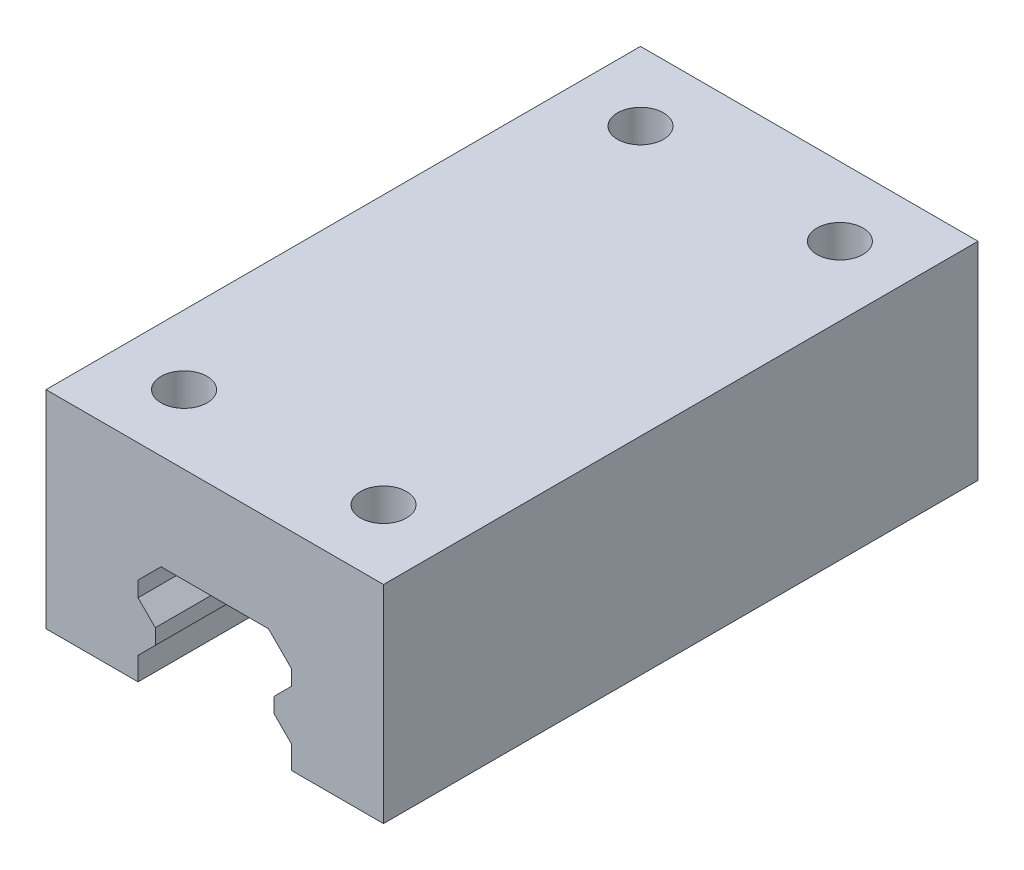
ISO-10303-21;
HEADER;
FILE_DESCRIPTION(('STEP AP214'),'2;1');
FILE_NAME('part.step','',(''),(''),'','','');
FILE_SCHEMA(('AUTOMOTIVE_DESIGN { 1 0 10303 214 1 1 1 1 }'));
ENDSEC;
DATA;
#1=APPLICATION_CONTEXT('core data for automotive mechanical design processes');
#2=APPLICATION_PROTOCOL_DEFINITION('international standard','automotive_design',2000,#1);
#3=PRODUCT_CONTEXT('',#1,'mechanical');
#4=PRODUCT('Part','Part','',(#3));
#5=PRODUCT_RELATED_PRODUCT_CATEGORY('part','',(#4));
#6=PRODUCT_DEFINITION_FORMATION('','',#4);
#7=PRODUCT_DEFINITION_CONTEXT('part definition',#1,'design');
#8=PRODUCT_DEFINITION('design','',#6,#7);
#9=PRODUCT_DEFINITION_SHAPE('','',#8);
#10=(LENGTH_UNIT() NAMED_UNIT(*) SI_UNIT(.MILLI.,.METRE.));
#11=(NAMED_UNIT(*) PLANE_ANGLE_UNIT() SI_UNIT($,.RADIAN.));
#12=(NAMED_UNIT(*) SI_UNIT($,.STERADIAN.) SOLID_ANGLE_UNIT());
#13=UNCERTAINTY_MEASURE_WITH_UNIT(LENGTH_MEASURE(1.E-05),#10,'distance_accuracy_value','');
#14=(GEOMETRIC_REPRESENTATION_CONTEXT(3) GLOBAL_UNCERTAINTY_ASSIGNED_CONTEXT((#13)) GLOBAL_UNIT_ASSIGNED_CONTEXT((#10,
#11,#12)) REPRESENTATION_CONTEXT('',''));
#15=CARTESIAN_POINT('',(0.,0.,0.));
#16=DIRECTION('',(0.,0.,1.));
#17=DIRECTION('',(1.,0.,0.));
#18=AXIS2_PLACEMENT_3D('',#15,#16,#17);
#19=CARTESIAN_POINT('',(22.,0.,-77.5));
#20=DIRECTION('',(-1.,0.,0.));
#21=DIRECTION('',(0.,-1.,0.));
#22=AXIS2_PLACEMENT_3D('',#19,#20,#21);
#23=PLANE('',#22);
#24=DIRECTION('',(0.,-1.,0.));
#25=VECTOR('',#24,1.);
#26=CARTESIAN_POINT('',(22.,0.,0.));
#27=LINE('',#26,#25);
#28=CARTESIAN_POINT('',(22.,32.3343195266273,0.));
#29=VERTEX_POINT('',#28);
#30=CARTESIAN_POINT('',(22.,5.33431952662725,0.));
#31=VERTEX_POINT('',#30);
#32=EDGE_CURVE('E203',#29,#31,#27,.T.);
#33=ORIENTED_EDGE('',*,*,#32,.T.);
#34=DIRECTION('',(0.,0.,1.));
#35=VECTOR('',#34,1.);
#36=CARTESIAN_POINT('',(22.,5.33431952662725,-77.5));
#37=LINE('',#36,#35);
#38=CARTESIAN_POINT('',(22.,5.33431952662725,-77.5));
#39=VERTEX_POINT('',#38);
#40=EDGE_CURVE('E11',#39,#31,#37,.T.);
#41=ORIENTED_EDGE('',*,*,#40,.F.);
#42=DIRECTION('',(0.,-1.,0.));
#43=VECTOR('',#42,1.);
#44=CARTESIAN_POINT('',(22.,0.,-77.5));
#45=LINE('',#44,#43);
#46=CARTESIAN_POINT('',(22.,32.3343195266273,-77.5));
#47=VERTEX_POINT('',#46);
#48=EDGE_CURVE('E267',#47,#39,#45,.T.);
#49=ORIENTED_EDGE('',*,*,#48,.F.);
#50=DIRECTION('',(0.,0.,1.));
#51=VECTOR('',#50,1.);
#52=CARTESIAN_POINT('',(22.,32.3343195266273,-77.5));
#53=LINE('',#52,#51);
#54=EDGE_CURVE('E44',#47,#29,#53,.T.);
#55=ORIENTED_EDGE('',*,*,#54,.T.);
#56=EDGE_LOOP('',(#33,#41,#49,#55));
#57=FACE_BOUND('',#56,.T.);
#58=ADVANCED_FACE('F41',(#57),#23,.F.);
#59=CARTESIAN_POINT('',(0.,5.33431952662724,-77.5));
#60=DIRECTION('',(0.,1.,0.));
#61=DIRECTION('',(-1.,0.,0.));
#62=AXIS2_PLACEMENT_3D('',#59,#60,#61);
#63=PLANE('',#62);
#64=DIRECTION('',(-1.,0.,0.));
#65=VECTOR('',#64,1.);
#66=CARTESIAN_POINT('',(0.,5.33431952662724,0.));
#67=LINE('',#66,#65);
#68=CARTESIAN_POINT('',(9.99999999999999,5.33431952662725,0.));
#69=VERTEX_POINT('',#68);
#70=EDGE_CURVE('E115',#31,#69,#67,.T.);
#71=ORIENTED_EDGE('',*,*,#70,.T.);
#72=DIRECTION('',(0.,0.,1.));
#73=VECTOR('',#72,1.);
#74=CARTESIAN_POINT('',(9.99999999999999,5.33431952662725,-77.5));
#75=LINE('',#74,#73);
#76=CARTESIAN_POINT('',(9.99999999999999,5.33431952662725,-77.5));
#77=VERTEX_POINT('',#76);
#78=EDGE_CURVE('E51',#77,#69,#75,.T.);
#79=ORIENTED_EDGE('',*,*,#78,.F.);
#80=DIRECTION('',(-1.,0.,0.));
#81=VECTOR('',#80,1.);
#82=CARTESIAN_POINT('',(0.,5.33431952662724,-77.5));
#83=LINE('',#82,#81);
#84=EDGE_CURVE('E59',#39,#77,#83,.T.);
#85=ORIENTED_EDGE('',*,*,#84,.F.);
#86=ORIENTED_EDGE('',*,*,#40,.T.);
#87=EDGE_LOOP('',(#71,#79,#85,#86));
#88=FACE_BOUND('',#87,.T.);
#89=ADVANCED_FACE('F334',(#88),#63,.F.);
#90=CARTESIAN_POINT('',(9.99999999999999,0.,-77.5));
#91=DIRECTION('',(1.,0.,0.));
#92=DIRECTION('',(0.,1.,0.));
#93=AXIS2_PLACEMENT_3D('',#90,#91,#92);
#94=PLANE('',#93);
#95=DIRECTION('',(0.,1.,0.));
#96=VECTOR('',#95,1.);
#97=CARTESIAN_POINT('',(9.99999999999999,0.,0.));
#98=LINE('',#97,#96);
#99=CARTESIAN_POINT('',(9.99999999999999,8.33431952662725,0.));
#100=VERTEX_POINT('',#99);
#101=EDGE_CURVE('E184',#69,#100,#98,.T.);
#102=ORIENTED_EDGE('',*,*,#101,.T.);
#103=DIRECTION('',(0.,0.,1.));
#104=VECTOR('',#103,1.);
#105=CARTESIAN_POINT('',(9.99999999999999,8.33431952662725,-77.5));
#106=LINE('',#105,#104);
#107=CARTESIAN_POINT('',(9.99999999999999,8.33431952662725,-77.5));
#108=VERTEX_POINT('',#107);
#109=EDGE_CURVE('E182',#108,#100,#106,.T.);
#110=ORIENTED_EDGE('',*,*,#109,.F.);
#111=DIRECTION('',(0.,1.,0.));
#112=VECTOR('',#111,1.);
#113=CARTESIAN_POINT('',(9.99999999999999,0.,-77.5));
#114=LINE('',#113,#112);
#115=EDGE_CURVE('E172',#77,#108,#114,.T.);
#116=ORIENTED_EDGE('',*,*,#115,.F.);
#117=ORIENTED_EDGE('',*,*,#78,.T.);
#118=EDGE_LOOP('',(#102,#110,#116,#117));
#119=FACE_BOUND('',#118,.T.);
#120=ADVANCED_FACE('F183',(#119),#94,.F.);
#121=CARTESIAN_POINT('',(9.16715976331361,9.16715976331363,-77.5));
#122=DIRECTION('',(0.707106781186547,0.707106781186548,0.));
#123=DIRECTION('',(-0.707106781186548,0.707106781186547,0.));
#124=AXIS2_PLACEMENT_3D('',#121,#122,#123);
#125=PLANE('',#124);
#126=DIRECTION('',(-0.707106781186548,0.707106781186547,0.));
#127=VECTOR('',#126,1.);
#128=CARTESIAN_POINT('',(9.16715976331361,9.16715976331363,0.));
#129=LINE('',#128,#127);
#130=CARTESIAN_POINT('',(7.74999999999999,10.5843195266272,0.));
#131=VERTEX_POINT('',#130);
#132=EDGE_CURVE('E261',#100,#131,#129,.T.);
#133=ORIENTED_EDGE('',*,*,#132,.T.);
#134=DIRECTION('',(0.,0.,1.));
#135=VECTOR('',#134,1.);
#136=CARTESIAN_POINT('',(7.74999999999999,10.5843195266272,-77.5));
#137=LINE('',#136,#135);
#138=CARTESIAN_POINT('',(7.74999999999999,10.5843195266272,-77.5));
#139=VERTEX_POINT('',#138);
#140=EDGE_CURVE('E188',#139,#131,#137,.T.);
#141=ORIENTED_EDGE('',*,*,#140,.F.);
#142=DIRECTION('',(-0.707106781186548,0.707106781186547,0.));
#143=VECTOR('',#142,1.);
#144=CARTESIAN_POINT('',(9.16715976331361,9.16715976331363,-77.5));
#145=LINE('',#144,#143);
#146=EDGE_CURVE('E176',#108,#139,#145,.T.);
#147=ORIENTED_EDGE('',*,*,#146,.F.);
#148=ORIENTED_EDGE('',*,*,#109,.T.);
#149=EDGE_LOOP('',(#133,#141,#147,#148));
#150=FACE_BOUND('',#149,.T.);
#151=ADVANCED_FACE('F190',(#150),#125,.F.);
#152=CARTESIAN_POINT('',(7.74999999999999,0.,-77.5));
#153=DIRECTION('',(1.,0.,0.));
#154=DIRECTION('',(0.,0.,-1.));
#155=AXIS2_PLACEMENT_3D('',#152,#153,#154);
#156=PLANE('',#155);
#157=DIRECTION('',(0.,1.,0.));
#158=VECTOR('',#157,1.);
#159=CARTESIAN_POINT('',(7.74999999999999,0.,0.));
#160=LINE('',#159,#158);
#161=CARTESIAN_POINT('',(7.74999999999999,12.5843195266272,0.));
#162=VERTEX_POINT('',#161);
#163=EDGE_CURVE('E258',#131,#162,#160,.T.);
#164=ORIENTED_EDGE('',*,*,#163,.T.);
#165=DIRECTION('',(0.,0.,1.));
#166=VECTOR('',#165,1.);
#167=CARTESIAN_POINT('',(7.74999999999999,12.5843195266272,-77.5));
#168=LINE('',#167,#166);
#169=CARTESIAN_POINT('',(7.74999999999999,12.5843195266272,-77.5));
#170=VERTEX_POINT('',#169);
#171=EDGE_CURVE('E273',#170,#162,#168,.T.);
#172=ORIENTED_EDGE('',*,*,#171,.F.);
#173=DIRECTION('',(0.,1.,0.));
#174=VECTOR('',#173,1.);
#175=CARTESIAN_POINT('',(7.74999999999999,0.,-77.5));
#176=LINE('',#175,#174);
#177=EDGE_CURVE('E194',#139,#170,#176,.T.);
#178=ORIENTED_EDGE('',*,*,#177,.F.);
#179=ORIENTED_EDGE('',*,*,#140,.T.);
#180=EDGE_LOOP('',(#164,#172,#178,#179));
#181=FACE_BOUND('',#180,.T.);
#182=ADVANCED_FACE('F347',(#181),#156,.F.);
#183=CARTESIAN_POINT('',(-2.41715976331362,2.41715976331362,-77.5));
#184=DIRECTION('',(0.707106781186548,-0.707106781186547,0.));
#185=DIRECTION('',(0.707106781186547,0.707106781186548,0.));
#186=AXIS2_PLACEMENT_3D('',#183,#184,#185);
#187=PLANE('',#186);
#188=DIRECTION('',(0.707106781186547,0.707106781186548,0.));
#189=VECTOR('',#188,1.);
#190=CARTESIAN_POINT('',(-2.41715976331362,2.41715976331362,0.));
#191=LINE('',#190,#189);
#192=CARTESIAN_POINT('',(10.,14.8343195266273,0.));
#193=VERTEX_POINT('',#192);
#194=EDGE_CURVE('E255',#162,#193,#191,.T.);
#195=ORIENTED_EDGE('',*,*,#194,.T.);
#196=DIRECTION('',(0.,0.,1.));
#197=VECTOR('',#196,1.);
#198=CARTESIAN_POINT('',(10.,14.8343195266273,-77.5));
#199=LINE('',#198,#197);
#200=CARTESIAN_POINT('',(10.,14.8343195266273,-77.5));
#201=VERTEX_POINT('',#200);
#202=EDGE_CURVE('E277',#201,#193,#199,.T.);
#203=ORIENTED_EDGE('',*,*,#202,.F.);
#204=DIRECTION('',(0.707106781186547,0.707106781186548,0.));
#205=VECTOR('',#204,1.);
#206=CARTESIAN_POINT('',(-2.41715976331362,2.41715976331362,-77.5));
#207=LINE('',#206,#205);
#208=EDGE_CURVE('E197',#170,#201,#207,.T.);
#209=ORIENTED_EDGE('',*,*,#208,.F.);
#210=ORIENTED_EDGE('',*,*,#171,.T.);
#211=EDGE_LOOP('',(#195,#203,#209,#210));
#212=FACE_BOUND('',#211,.T.);
#213=ADVANCED_FACE('F350',(#212),#187,.F.);
#214=CARTESIAN_POINT('',(10.,0.,-77.5));
#215=DIRECTION('',(1.,0.,0.));
#216=DIRECTION('',(0.,0.,-1.));
#217=AXIS2_PLACEMENT_3D('',#214,#215,#216);
#218=PLANE('',#217);
#219=DIRECTION('',(0.,1.,0.));
#220=VECTOR('',#219,1.);
#221=CARTESIAN_POINT('',(10.,0.,0.));
#222=LINE('',#221,#220);
#223=CARTESIAN_POINT('',(10.,16.8343195266273,0.));
#224=VERTEX_POINT('',#223);
#225=EDGE_CURVE('E252',#193,#224,#222,.T.);
#226=ORIENTED_EDGE('',*,*,#225,.T.);
#227=DIRECTION('',(0.,0.,1.));
#228=VECTOR('',#227,1.);
#229=CARTESIAN_POINT('',(10.,16.8343195266273,-77.5));
#230=LINE('',#229,#228);
#231=CARTESIAN_POINT('',(10.,16.8343195266273,-77.5));
#232=VERTEX_POINT('',#231);
#233=EDGE_CURVE('E281',#232,#224,#230,.T.);
#234=ORIENTED_EDGE('',*,*,#233,.F.);
#235=DIRECTION('',(0.,1.,0.));
#236=VECTOR('',#235,1.);
#237=CARTESIAN_POINT('',(10.,0.,-77.5));
#238=LINE('',#237,#236);
#239=EDGE_CURVE('E443',#201,#232,#238,.T.);
#240=ORIENTED_EDGE('',*,*,#239,.F.);
#241=ORIENTED_EDGE('',*,*,#202,.T.);
#242=EDGE_LOOP('',(#226,#234,#240,#241));
#243=FACE_BOUND('',#242,.T.);
#244=ADVANCED_FACE('F354',(#243),#218,.F.);
#245=CARTESIAN_POINT('',(13.4171597633136,13.4171597633137,-77.5));
#246=DIRECTION('',(0.707106781186546,0.707106781186549,0.));
#247=DIRECTION('',(-0.707106781186549,0.707106781186546,0.));
#248=AXIS2_PLACEMENT_3D('',#245,#246,#247);
#249=PLANE('',#248);
#250=DIRECTION('',(-0.707106781186549,0.707106781186546,0.));
#251=VECTOR('',#250,1.);
#252=CARTESIAN_POINT('',(13.4171597633136,13.4171597633137,0.));
#253=LINE('',#252,#251);
#254=CARTESIAN_POINT('',(7.,19.8343195266273,0.));
#255=VERTEX_POINT('',#254);
#256=EDGE_CURVE('E248',#224,#255,#253,.T.);
#257=ORIENTED_EDGE('',*,*,#256,.T.);
#258=DIRECTION('',(0.,0.,1.));
#259=VECTOR('',#258,1.);
#260=CARTESIAN_POINT('',(7.,19.8343195266273,-77.5));
#261=LINE('',#260,#259);
#262=CARTESIAN_POINT('',(7.,19.8343195266273,-77.5));
#263=VERTEX_POINT('',#262);
#264=EDGE_CURVE('E285',#263,#255,#261,.T.);
#265=ORIENTED_EDGE('',*,*,#264,.F.);
#266=DIRECTION('',(-0.707106781186549,0.707106781186546,0.));
#267=VECTOR('',#266,1.);
#268=CARTESIAN_POINT('',(13.4171597633136,13.4171597633137,-77.5));
#269=LINE('',#268,#267);
#270=EDGE_CURVE('E440',#232,#263,#269,.T.);
#271=ORIENTED_EDGE('',*,*,#270,.F.);
#272=ORIENTED_EDGE('',*,*,#233,.T.);
#273=EDGE_LOOP('',(#257,#265,#271,#272));
#274=FACE_BOUND('',#273,.T.);
#275=ADVANCED_FACE('F358',(#274),#249,.F.);
#276=CARTESIAN_POINT('',(0.,19.8343195266273,-77.5));
#277=DIRECTION('',(0.,-1.,0.));
#278=DIRECTION('',(1.,0.,0.));
#279=AXIS2_PLACEMENT_3D('',#276,#277,#278);
#280=PLANE('',#279);
#281=DIRECTION('',(1.,0.,0.));
#282=VECTOR('',#281,1.);
#283=CARTESIAN_POINT('',(0.,19.8343195266273,0.));
#284=LINE('',#283,#282);
#285=CARTESIAN_POINT('',(-6.99999999999999,19.8343195266273,0.));
#286=VERTEX_POINT('',#285);
#287=EDGE_CURVE('E244',#286,#255,#284,.T.);
#288=ORIENTED_EDGE('',*,*,#287,.F.);
#289=DIRECTION('',(0.,0.,1.));
#290=VECTOR('',#289,1.);
#291=CARTESIAN_POINT('',(-6.99999999999999,19.8343195266273,-77.5));
#292=LINE('',#291,#290);
#293=CARTESIAN_POINT('',(-6.99999999999999,19.8343195266273,-77.5));
#294=VERTEX_POINT('',#293);
#295=EDGE_CURVE('E288',#294,#286,#292,.T.);
#296=ORIENTED_EDGE('',*,*,#295,.F.);
#297=DIRECTION('',(1.,0.,0.));
#298=VECTOR('',#297,1.);
#299=CARTESIAN_POINT('',(0.,19.8343195266273,-77.5));
#300=LINE('',#299,#298);
#301=EDGE_CURVE('E436',#294,#263,#300,.T.);
#302=ORIENTED_EDGE('',*,*,#301,.T.);
#303=ORIENTED_EDGE('',*,*,#264,.T.);
#304=EDGE_LOOP('',(#288,#296,#302,#303));
#305=FACE_BOUND('',#304,.T.);
#306=ADVANCED_FACE('F362',(#305),#280,.T.);
#307=CARTESIAN_POINT('',(-13.4171597633136,13.4171597633137,-77.5));
#308=DIRECTION('',(0.707106781186546,-0.707106781186548,0.));
#309=DIRECTION('',(0.707106781186549,0.707106781186546,0.));
#310=AXIS2_PLACEMENT_3D('',#307,#308,#309);
#311=PLANE('',#310);
#312=DIRECTION('',(0.707106781186549,0.707106781186547,0.));
#313=VECTOR('',#312,1.);
#314=CARTESIAN_POINT('',(-13.4171597633136,13.4171597633137,0.));
#315=LINE('',#314,#313);
#316=CARTESIAN_POINT('',(-9.99999999999999,16.8343195266273,0.));
#317=VERTEX_POINT('',#316);
#318=EDGE_CURVE('E240',#317,#286,#315,.T.);
#319=ORIENTED_EDGE('',*,*,#318,.F.);
#320=DIRECTION('',(0.,0.,1.));
#321=VECTOR('',#320,1.);
#322=CARTESIAN_POINT('',(-9.99999999999999,16.8343195266273,-77.5));
#323=LINE('',#322,#321);
#324=CARTESIAN_POINT('',(-9.99999999999999,16.8343195266273,-77.5));
#325=VERTEX_POINT('',#324);
#326=EDGE_CURVE('E291',#325,#317,#323,.T.);
#327=ORIENTED_EDGE('',*,*,#326,.F.);
#328=DIRECTION('',(0.707106781186549,0.707106781186547,0.));
#329=VECTOR('',#328,1.);
#330=CARTESIAN_POINT('',(-13.4171597633136,13.4171597633137,-77.5));
#331=LINE('',#330,#329);
#332=EDGE_CURVE('E432',#325,#294,#331,.T.);
#333=ORIENTED_EDGE('',*,*,#332,.T.);
#334=ORIENTED_EDGE('',*,*,#295,.T.);
#335=EDGE_LOOP('',(#319,#327,#333,#334));
#336=FACE_BOUND('',#335,.T.);
#337=ADVANCED_FACE('F366',(#336),#311,.T.);
#338=CARTESIAN_POINT('',(-9.99999999999999,0.,-77.5));
#339=DIRECTION('',(1.,0.,0.));
#340=DIRECTION('',(0.,0.,-1.));
#341=AXIS2_PLACEMENT_3D('',#338,#339,#340);
#342=PLANE('',#341);
#343=DIRECTION('',(0.,1.,0.));
#344=VECTOR('',#343,1.);
#345=CARTESIAN_POINT('',(-9.99999999999999,0.,0.));
#346=LINE('',#345,#344);
#347=CARTESIAN_POINT('',(-9.99999999999999,14.8343195266273,0.));
#348=VERTEX_POINT('',#347);
#349=EDGE_CURVE('E236',#348,#317,#346,.T.);
#350=ORIENTED_EDGE('',*,*,#349,.F.);
#351=DIRECTION('',(0.,0.,1.));
#352=VECTOR('',#351,1.);
#353=CARTESIAN_POINT('',(-9.99999999999999,14.8343195266273,-77.5));
#354=LINE('',#353,#352);
#355=CARTESIAN_POINT('',(-9.99999999999999,14.8343195266273,-77.5));
#356=VERTEX_POINT('',#355);
#357=EDGE_CURVE('E294',#356,#348,#354,.T.);
#358=ORIENTED_EDGE('',*,*,#357,.F.);
#359=DIRECTION('',(0.,1.,0.));
#360=VECTOR('',#359,1.);
#361=CARTESIAN_POINT('',(-9.99999999999999,0.,-77.5));
#362=LINE('',#361,#360);
#363=EDGE_CURVE('E428',#356,#325,#362,.T.);
#364=ORIENTED_EDGE('',*,*,#363,.T.);
#365=ORIENTED_EDGE('',*,*,#326,.T.);
#366=EDGE_LOOP('',(#350,#358,#364,#365));
#367=FACE_BOUND('',#366,.T.);
#368=ADVANCED_FACE('F370',(#367),#342,.T.);
#369=CARTESIAN_POINT('',(2.41715976331362,2.41715976331361,-77.5));
#370=DIRECTION('',(0.707106781186549,0.707106781186546,0.));
#371=DIRECTION('',(-0.707106781186546,0.707106781186549,0.));
#372=AXIS2_PLACEMENT_3D('',#369,#370,#371);
#373=PLANE('',#372);
#374=DIRECTION('',(-0.707106781186546,0.707106781186549,0.));
#375=VECTOR('',#374,1.);
#376=CARTESIAN_POINT('',(2.41715976331362,2.41715976331361,0.));
#377=LINE('',#376,#375);
#378=CARTESIAN_POINT('',(-7.74999999999999,12.5843195266272,0.));
#379=VERTEX_POINT('',#378);
#380=EDGE_CURVE('E232',#379,#348,#377,.T.);
#381=ORIENTED_EDGE('',*,*,#380,.F.);
#382=DIRECTION('',(0.,0.,1.));
#383=VECTOR('',#382,1.);
#384=CARTESIAN_POINT('',(-7.74999999999999,12.5843195266272,-77.5));
#385=LINE('',#384,#383);
#386=CARTESIAN_POINT('',(-7.74999999999999,12.5843195266272,-77.5));
#387=VERTEX_POINT('',#386);
#388=EDGE_CURVE('E297',#387,#379,#385,.T.);
#389=ORIENTED_EDGE('',*,*,#388,.F.);
#390=DIRECTION('',(-0.707106781186546,0.707106781186549,0.));
#391=VECTOR('',#390,1.);
#392=CARTESIAN_POINT('',(2.41715976331362,2.41715976331361,-77.5));
#393=LINE('',#392,#391);
#394=EDGE_CURVE('E424',#387,#356,#393,.T.);
#395=ORIENTED_EDGE('',*,*,#394,.T.);
#396=ORIENTED_EDGE('',*,*,#357,.T.);
#397=EDGE_LOOP('',(#381,#389,#395,#396));
#398=FACE_BOUND('',#397,.T.);
#399=ADVANCED_FACE('F374',(#398),#373,.T.);
#400=CARTESIAN_POINT('',(-7.74999999999999,0.,-77.5));
#401=DIRECTION('',(1.,0.,0.));
#402=DIRECTION('',(0.,0.,-1.));
#403=AXIS2_PLACEMENT_3D('',#400,#401,#402);
#404=PLANE('',#403);
#405=DIRECTION('',(0.,1.,0.));
#406=VECTOR('',#405,1.);
#407=CARTESIAN_POINT('',(-7.74999999999999,0.,0.));
#408=LINE('',#407,#406);
#409=CARTESIAN_POINT('',(-7.74999999999999,10.5843195266272,0.));
#410=VERTEX_POINT('',#409);
#411=EDGE_CURVE('E228',#410,#379,#408,.T.);
#412=ORIENTED_EDGE('',*,*,#411,.F.);
#413=DIRECTION('',(0.,0.,1.));
#414=VECTOR('',#413,1.);
#415=CARTESIAN_POINT('',(-7.74999999999999,10.5843195266272,-77.5));
#416=LINE('',#415,#414);
#417=CARTESIAN_POINT('',(-7.74999999999999,10.5843195266272,-77.5));
#418=VERTEX_POINT('',#417);
#419=EDGE_CURVE('E300',#418,#410,#416,.T.);
#420=ORIENTED_EDGE('',*,*,#419,.F.);
#421=DIRECTION('',(0.,1.,0.));
#422=VECTOR('',#421,1.);
#423=CARTESIAN_POINT('',(-7.74999999999999,0.,-77.5));
#424=LINE('',#423,#422);
#425=EDGE_CURVE('E420',#418,#387,#424,.T.);
#426=ORIENTED_EDGE('',*,*,#425,.T.);
#427=ORIENTED_EDGE('',*,*,#388,.T.);
#428=EDGE_LOOP('',(#412,#420,#426,#427));
#429=FACE_BOUND('',#428,.T.);
#430=ADVANCED_FACE('F378',(#429),#404,.T.);
#431=CARTESIAN_POINT('',(-9.16715976331361,9.16715976331363,-77.5));
#432=DIRECTION('',(0.707106781186547,-0.707106781186548,0.));
#433=DIRECTION('',(0.707106781186548,0.707106781186547,0.));
#434=AXIS2_PLACEMENT_3D('',#431,#432,#433);
#435=PLANE('',#434);
#436=DIRECTION('',(0.707106781186548,0.707106781186547,0.));
#437=VECTOR('',#436,1.);
#438=CARTESIAN_POINT('',(-9.16715976331361,9.16715976331363,0.));
#439=LINE('',#438,#437);
#440=CARTESIAN_POINT('',(-10.,8.33431952662725,0.));
#441=VERTEX_POINT('',#440);
#442=EDGE_CURVE('E224',#441,#410,#439,.T.);
#443=ORIENTED_EDGE('',*,*,#442,.F.);
#444=DIRECTION('',(0.,0.,1.));
#445=VECTOR('',#444,1.);
#446=CARTESIAN_POINT('',(-10.,8.33431952662725,-77.5));
#447=LINE('',#446,#445);
#448=CARTESIAN_POINT('',(-10.,8.33431952662725,-77.5));
#449=VERTEX_POINT('',#448);
#450=EDGE_CURVE('E303',#449,#441,#447,.T.);
#451=ORIENTED_EDGE('',*,*,#450,.F.);
#452=DIRECTION('',(0.707106781186548,0.707106781186547,0.));
#453=VECTOR('',#452,1.);
#454=CARTESIAN_POINT('',(-9.16715976331361,9.16715976331363,-77.5));
#455=LINE('',#454,#453);
#456=EDGE_CURVE('E416',#449,#418,#455,.T.);
#457=ORIENTED_EDGE('',*,*,#456,.T.);
#458=ORIENTED_EDGE('',*,*,#419,.T.);
#459=EDGE_LOOP('',(#443,#451,#457,#458));
#460=FACE_BOUND('',#459,.T.);
#461=ADVANCED_FACE('F382',(#460),#435,.T.);
#462=CARTESIAN_POINT('',(-9.99999999999999,0.,-77.5));
#463=DIRECTION('',(1.,0.,0.));
#464=DIRECTION('',(0.,1.,0.));
#465=AXIS2_PLACEMENT_3D('',#462,#463,#464);
#466=PLANE('',#465);
#467=DIRECTION('',(0.,1.,0.));
#468=VECTOR('',#467,1.);
#469=CARTESIAN_POINT('',(-9.99999999999999,0.,0.));
#470=LINE('',#469,#468);
#471=CARTESIAN_POINT('',(-9.99999999999999,5.33431952662725,0.));
#472=VERTEX_POINT('',#471);
#473=EDGE_CURVE('E220',#472,#441,#470,.T.);
#474=ORIENTED_EDGE('',*,*,#473,.F.);
#475=DIRECTION('',(0.,0.,1.));
#476=VECTOR('',#475,1.);
#477=CARTESIAN_POINT('',(-9.99999999999999,5.33431952662725,-77.5));
#478=LINE('',#477,#476);
#479=CARTESIAN_POINT('',(-9.99999999999999,5.33431952662725,-77.5));
#480=VERTEX_POINT('',#479);
#481=EDGE_CURVE('E306',#480,#472,#478,.T.);
#482=ORIENTED_EDGE('',*,*,#481,.F.);
#483=DIRECTION('',(0.,1.,0.));
#484=VECTOR('',#483,1.);
#485=CARTESIAN_POINT('',(-9.99999999999999,0.,-77.5));
#486=LINE('',#485,#484);
#487=EDGE_CURVE('E408',#480,#449,#486,.T.);
#488=ORIENTED_EDGE('',*,*,#487,.T.);
#489=ORIENTED_EDGE('',*,*,#450,.T.);
#490=EDGE_LOOP('',(#474,#482,#488,#489));
#491=FACE_BOUND('',#490,.T.);
#492=ADVANCED_FACE('F386',(#491),#466,.T.);
#493=CARTESIAN_POINT('',(0.,5.33431952662724,-77.5));
#494=DIRECTION('',(0.,-1.,0.));
#495=DIRECTION('',(1.,0.,0.));
#496=AXIS2_PLACEMENT_3D('',#493,#494,#495);
#497=PLANE('',#496);
#498=DIRECTION('',(1.,0.,0.));
#499=VECTOR('',#498,1.);
#500=CARTESIAN_POINT('',(0.,5.33431952662724,0.));
#501=LINE('',#500,#499);
#502=CARTESIAN_POINT('',(-22.,5.33431952662725,0.));
#503=VERTEX_POINT('',#502);
#504=EDGE_CURVE('E216',#503,#472,#501,.T.);
#505=ORIENTED_EDGE('',*,*,#504,.F.);
#506=DIRECTION('',(0.,0.,1.));
#507=VECTOR('',#506,1.);
#508=CARTESIAN_POINT('',(-22.,5.33431952662725,-77.5));
#509=LINE('',#508,#507);
#510=CARTESIAN_POINT('',(-22.,5.33431952662725,-77.5));
#511=VERTEX_POINT('',#510);
#512=EDGE_CURVE('E309',#511,#503,#509,.T.);
#513=ORIENTED_EDGE('',*,*,#512,.F.);
#514=DIRECTION('',(1.,0.,0.));
#515=VECTOR('',#514,1.);
#516=CARTESIAN_POINT('',(0.,5.33431952662724,-77.5));
#517=LINE('',#516,#515);
#518=EDGE_CURVE('E403',#511,#480,#517,.T.);
#519=ORIENTED_EDGE('',*,*,#518,.T.);
#520=ORIENTED_EDGE('',*,*,#481,.T.);
#521=EDGE_LOOP('',(#505,#513,#519,#520));
#522=FACE_BOUND('',#521,.T.);
#523=ADVANCED_FACE('F328',(#522),#497,.T.);
#524=CARTESIAN_POINT('',(-22.,0.,-77.5));
#525=DIRECTION('',(-1.,0.,0.));
#526=DIRECTION('',(0.,-1.,0.));
#527=AXIS2_PLACEMENT_3D('',#524,#525,#526);
#528=PLANE('',#527);
#529=DIRECTION('',(0.,-1.,0.));
#530=VECTOR('',#529,1.);
#531=CARTESIAN_POINT('',(-22.,0.,0.));
#532=LINE('',#531,#530);
#533=CARTESIAN_POINT('',(-22.,32.3343195266273,0.));
#534=VERTEX_POINT('',#533);
#535=EDGE_CURVE('E212',#534,#503,#532,.T.);
#536=ORIENTED_EDGE('',*,*,#535,.F.);
#537=DIRECTION('',(0.,0.,1.));
#538=VECTOR('',#537,1.);
#539=CARTESIAN_POINT('',(-22.,32.3343195266273,-77.5));
#540=LINE('',#539,#538);
#541=CARTESIAN_POINT('',(-22.,32.3343195266273,-77.5));
#542=VERTEX_POINT('',#541);
#543=EDGE_CURVE('E311',#542,#534,#540,.T.);
#544=ORIENTED_EDGE('',*,*,#543,.F.);
#545=DIRECTION('',(0.,-1.,0.));
#546=VECTOR('',#545,1.);
#547=CARTESIAN_POINT('',(-22.,0.,-77.5));
#548=LINE('',#547,#546);
#549=EDGE_CURVE('E401',#542,#511,#548,.T.);
#550=ORIENTED_EDGE('',*,*,#549,.T.);
#551=ORIENTED_EDGE('',*,*,#512,.T.);
#552=EDGE_LOOP('',(#536,#544,#550,#551));
#553=FACE_BOUND('',#552,.T.);
#554=ADVANCED_FACE('F321',(#553),#528,.T.);
#555=CARTESIAN_POINT('',(0.,32.3343195266273,-77.5));
#556=DIRECTION('',(0.,1.,0.));
#557=DIRECTION('',(-1.,0.,0.));
#558=AXIS2_PLACEMENT_3D('',#555,#556,#557);
#559=PLANE('',#558);
#560=CARTESIAN_POINT('',(13.,32.3343195266273,-8.99999999999999));
#561=DIRECTION('',(0.,1.,0.));
#562=DIRECTION('',(0.,0.,-1.));
#563=AXIS2_PLACEMENT_3D('',#560,#561,#562);
#564=CIRCLE('',#563,3.);
#565=CARTESIAN_POINT('',(13.,32.3343195266273,-12.));
#566=VERTEX_POINT('',#565);
#567=EDGE_CURVE('E480',#566,#566,#564,.T.);
#568=ORIENTED_EDGE('',*,*,#567,.F.);
#569=EDGE_LOOP('',(#568));
#570=FACE_BOUND('',#569,.T.);
#571=CARTESIAN_POINT('',(13.,32.3343195266273,-68.5));
#572=DIRECTION('',(0.,1.,0.));
#573=DIRECTION('',(0.,0.,-1.));
#574=AXIS2_PLACEMENT_3D('',#571,#572,#573);
#575=CIRCLE('',#574,3.00000000000001);
#576=CARTESIAN_POINT('',(13.,32.3343195266273,-71.5));
#577=VERTEX_POINT('',#576);
#578=EDGE_CURVE('E488',#577,#577,#575,.T.);
#579=ORIENTED_EDGE('',*,*,#578,.F.);
#580=EDGE_LOOP('',(#579));
#581=FACE_BOUND('',#580,.T.);
#582=CARTESIAN_POINT('',(-13.,32.3343195266273,-68.5));
#583=DIRECTION('',(0.,1.,0.));
#584=DIRECTION('',(0.,0.,1.));
#585=AXIS2_PLACEMENT_3D('',#582,#583,#584);
#586=CIRCLE('',#585,3.);
#587=CARTESIAN_POINT('',(-13.,32.3343195266273,-65.5));
#588=VERTEX_POINT('',#587);
#589=EDGE_CURVE('E496',#588,#588,#586,.T.);
#590=ORIENTED_EDGE('',*,*,#589,.F.);
#591=EDGE_LOOP('',(#590));
#592=FACE_BOUND('',#591,.T.);
#593=CARTESIAN_POINT('',(-13.,32.3343195266273,-8.99999999999999));
#594=DIRECTION('',(0.,1.,0.));
#595=DIRECTION('',(0.,0.,1.));
#596=AXIS2_PLACEMENT_3D('',#593,#594,#595);
#597=CIRCLE('',#596,3.);
#598=CARTESIAN_POINT('',(-13.,32.3343195266273,-5.99999999999999));
#599=VERTEX_POINT('',#598);
#600=EDGE_CURVE('E472',#599,#599,#597,.T.);
#601=ORIENTED_EDGE('',*,*,#600,.F.);
#602=EDGE_LOOP('',(#601));
#603=FACE_BOUND('',#602,.T.);
#604=DIRECTION('',(-1.,0.,0.));
#605=VECTOR('',#604,1.);
#606=CARTESIAN_POINT('',(0.,32.3343195266273,0.));
#607=LINE('',#606,#605);
#608=EDGE_CURVE('E207',#29,#534,#607,.T.);
#609=ORIENTED_EDGE('',*,*,#608,.F.);
#610=ORIENTED_EDGE('',*,*,#54,.F.);
#611=DIRECTION('',(-1.,0.,0.));
#612=VECTOR('',#611,1.);
#613=CARTESIAN_POINT('',(0.,32.3343195266273,-77.5));
#614=LINE('',#613,#612);
#615=EDGE_CURVE('E404',#47,#542,#614,.T.);
#616=ORIENTED_EDGE('',*,*,#615,.T.);
#617=ORIENTED_EDGE('',*,*,#543,.T.);
#618=EDGE_LOOP('',(#609,#610,#616,#617));
#619=FACE_BOUND('',#618,.T.);
#620=ADVANCED_FACE('F319',(#570,#581,#592,#603,#619),#559,.T.);
#621=CARTESIAN_POINT('',(0.,0.,-77.5));
#622=DIRECTION('',(0.,0.,1.));
#623=DIRECTION('',(1.,0.,0.));
#624=AXIS2_PLACEMENT_3D('',#621,#622,#623);
#625=PLANE('',#624);
#626=ORIENTED_EDGE('',*,*,#48,.T.);
#627=ORIENTED_EDGE('',*,*,#84,.T.);
#628=ORIENTED_EDGE('',*,*,#115,.T.);
#629=ORIENTED_EDGE('',*,*,#146,.T.);
#630=ORIENTED_EDGE('',*,*,#177,.T.);
#631=ORIENTED_EDGE('',*,*,#208,.T.);
#632=ORIENTED_EDGE('',*,*,#239,.T.);
#633=ORIENTED_EDGE('',*,*,#270,.T.);
#634=ORIENTED_EDGE('',*,*,#301,.F.);
#635=ORIENTED_EDGE('',*,*,#332,.F.);
#636=ORIENTED_EDGE('',*,*,#363,.F.);
#637=ORIENTED_EDGE('',*,*,#394,.F.);
#638=ORIENTED_EDGE('',*,*,#425,.F.);
#639=ORIENTED_EDGE('',*,*,#456,.F.);
#640=ORIENTED_EDGE('',*,*,#487,.F.);
#641=ORIENTED_EDGE('',*,*,#518,.F.);
#642=ORIENTED_EDGE('',*,*,#549,.F.);
#643=ORIENTED_EDGE('',*,*,#615,.F.);
#644=EDGE_LOOP('',(#626,#627,#628,#629,#630,#631,#632,#633,#634,#635,#636,#637,#638,#639,#640,
#641,#642,#643));
#645=FACE_BOUND('',#644,.T.);
#646=ADVANCED_FACE('F174',(#645),#625,.F.);
#647=CARTESIAN_POINT('',(0.,0.,0.));
#648=DIRECTION('',(0.,0.,1.));
#649=DIRECTION('',(1.,0.,0.));
#650=AXIS2_PLACEMENT_3D('',#647,#648,#649);
#651=PLANE('',#650);
#652=ORIENTED_EDGE('',*,*,#32,.F.);
#653=ORIENTED_EDGE('',*,*,#608,.T.);
#654=ORIENTED_EDGE('',*,*,#535,.T.);
#655=ORIENTED_EDGE('',*,*,#504,.T.);
#656=ORIENTED_EDGE('',*,*,#473,.T.);
#657=ORIENTED_EDGE('',*,*,#442,.T.);
#658=ORIENTED_EDGE('',*,*,#411,.T.);
#659=ORIENTED_EDGE('',*,*,#380,.T.);
#660=ORIENTED_EDGE('',*,*,#349,.T.);
#661=ORIENTED_EDGE('',*,*,#318,.T.);
#662=ORIENTED_EDGE('',*,*,#287,.T.);
#663=ORIENTED_EDGE('',*,*,#256,.F.);
#664=ORIENTED_EDGE('',*,*,#225,.F.);
#665=ORIENTED_EDGE('',*,*,#194,.F.);
#666=ORIENTED_EDGE('',*,*,#163,.F.);
#667=ORIENTED_EDGE('',*,*,#132,.F.);
#668=ORIENTED_EDGE('',*,*,#101,.F.);
#669=ORIENTED_EDGE('',*,*,#70,.F.);
#670=EDGE_LOOP('',(#652,#653,#654,#655,#656,#657,#658,#659,#660,#661,#662,#663,#664,#665,#666,
#667,#668,#669));
#671=FACE_BOUND('',#670,.T.);
#672=ADVANCED_FACE('F318',(#671),#651,.T.);
#673=CARTESIAN_POINT('',(-13.,22.3343195266273,-8.99999999999999));
#674=DIRECTION('',(0.,1.,0.));
#675=DIRECTION('',(0.,0.,1.));
#676=AXIS2_PLACEMENT_3D('',#673,#674,#675);
#677=CYLINDRICAL_SURFACE('',#676,3.);
#678=CARTESIAN_POINT('',(-13.,22.3343195266273,-8.99999999999999));
#679=DIRECTION('',(0.,1.,0.));
#680=DIRECTION('',(0.,0.,1.));
#681=AXIS2_PLACEMENT_3D('',#678,#679,#680);
#682=CIRCLE('',#681,3.);
#683=CARTESIAN_POINT('',(-13.,22.3343195266273,-5.99999999999999));
#684=VERTEX_POINT('',#683);
#685=EDGE_CURVE('E208',#684,#684,#682,.T.);
#686=ORIENTED_EDGE('',*,*,#685,.F.);
#687=EDGE_LOOP('',(#686));
#688=FACE_BOUND('',#687,.T.);
#689=ORIENTED_EDGE('',*,*,#600,.T.);
#690=EDGE_LOOP('',(#689));
#691=FACE_BOUND('',#690,.T.);
#692=ADVANCED_FACE('F516',(#688,#691),#677,.F.);
#693=CARTESIAN_POINT('',(-13.,22.3343195266273,-8.99999999999999));
#694=DIRECTION('',(0.,1.,0.));
#695=DIRECTION('',(0.,0.,1.));
#696=AXIS2_PLACEMENT_3D('',#693,#694,#695);
#697=PLANE('',#696);
#698=ORIENTED_EDGE('',*,*,#685,.T.);
#699=EDGE_LOOP('',(#698));
#700=FACE_BOUND('',#699,.T.);
#701=ADVANCED_FACE('F509',(#700),#697,.T.);
#702=CARTESIAN_POINT('',(-13.,22.3343195266273,-68.5));
#703=DIRECTION('',(0.,1.,0.));
#704=DIRECTION('',(0.,0.,1.));
#705=AXIS2_PLACEMENT_3D('',#702,#703,#704);
#706=CYLINDRICAL_SURFACE('',#705,3.);
#707=CARTESIAN_POINT('',(-13.,22.3343195266273,-68.5));
#708=DIRECTION('',(0.,1.,0.));
#709=DIRECTION('',(0.,0.,1.));
#710=AXIS2_PLACEMENT_3D('',#707,#708,#709);
#711=CIRCLE('',#710,3.);
#712=CARTESIAN_POINT('',(-13.,22.3343195266273,-65.5));
#713=VERTEX_POINT('',#712);
#714=EDGE_CURVE('E476',#713,#713,#711,.T.);
#715=ORIENTED_EDGE('',*,*,#714,.F.);
#716=EDGE_LOOP('',(#715));
#717=FACE_BOUND('',#716,.T.);
#718=ORIENTED_EDGE('',*,*,#589,.T.);
#719=EDGE_LOOP('',(#718));
#720=FACE_BOUND('',#719,.T.);
#721=ADVANCED_FACE('F506',(#717,#720),#706,.F.);
#722=CARTESIAN_POINT('',(-13.,22.3343195266273,-68.5));
#723=DIRECTION('',(0.,1.,0.));
#724=DIRECTION('',(0.,0.,1.));
#725=AXIS2_PLACEMENT_3D('',#722,#723,#724);
#726=PLANE('',#725);
#727=ORIENTED_EDGE('',*,*,#714,.T.);
#728=EDGE_LOOP('',(#727));
#729=FACE_BOUND('',#728,.T.);
#730=ADVANCED_FACE('F504',(#729),#726,.T.);
#731=CARTESIAN_POINT('',(13.,22.3343195266273,-68.5));
#732=DIRECTION('',(0.,1.,0.));
#733=DIRECTION('',(0.,0.,1.));
#734=AXIS2_PLACEMENT_3D('',#731,#732,#733);
#735=CYLINDRICAL_SURFACE('',#734,3.00000000000001);
#736=CARTESIAN_POINT('',(13.,22.3343195266273,-68.5));
#737=DIRECTION('',(0.,1.,0.));
#738=DIRECTION('',(0.,0.,-1.));
#739=AXIS2_PLACEMENT_3D('',#736,#737,#738);
#740=CIRCLE('',#739,3.00000000000001);
#741=CARTESIAN_POINT('',(13.,22.3343195266273,-71.5));
#742=VERTEX_POINT('',#741);
#743=EDGE_CURVE('E492',#742,#742,#740,.T.);
#744=ORIENTED_EDGE('',*,*,#743,.F.);
#745=EDGE_LOOP('',(#744));
#746=FACE_BOUND('',#745,.T.);
#747=ORIENTED_EDGE('',*,*,#578,.T.);
#748=EDGE_LOOP('',(#747));
#749=FACE_BOUND('',#748,.T.);
#750=ADVANCED_FACE('F537',(#746,#749),#735,.F.);
#751=CARTESIAN_POINT('',(13.,22.3343195266273,-68.5));
#752=DIRECTION('',(0.,-1.,0.));
#753=DIRECTION('',(0.,0.,-1.));
#754=AXIS2_PLACEMENT_3D('',#751,#752,#753);
#755=PLANE('',#754);
#756=ORIENTED_EDGE('',*,*,#743,.T.);
#757=EDGE_LOOP('',(#756));
#758=FACE_BOUND('',#757,.T.);
#759=ADVANCED_FACE('F532',(#758),#755,.F.);
#760=CARTESIAN_POINT('',(13.,22.3343195266273,-8.99999999999999));
#761=DIRECTION('',(0.,1.,0.));
#762=DIRECTION('',(0.,0.,1.));
#763=AXIS2_PLACEMENT_3D('',#760,#761,#762);
#764=CYLINDRICAL_SURFACE('',#763,3.);
#765=CARTESIAN_POINT('',(13.,22.3343195266273,-8.99999999999999));
#766=DIRECTION('',(0.,1.,0.));
#767=DIRECTION('',(0.,0.,-1.));
#768=AXIS2_PLACEMENT_3D('',#765,#766,#767);
#769=CIRCLE('',#768,3.);
#770=CARTESIAN_POINT('',(13.,22.3343195266273,-12.));
#771=VERTEX_POINT('',#770);
#772=EDGE_CURVE('E484',#771,#771,#769,.T.);
#773=ORIENTED_EDGE('',*,*,#772,.F.);
#774=EDGE_LOOP('',(#773));
#775=FACE_BOUND('',#774,.T.);
#776=ORIENTED_EDGE('',*,*,#567,.T.);
#777=EDGE_LOOP('',(#776));
#778=FACE_BOUND('',#777,.T.);
#779=ADVANCED_FACE('F528',(#775,#778),#764,.F.);
#780=CARTESIAN_POINT('',(13.,22.3343195266273,-8.99999999999999));
#781=DIRECTION('',(0.,-1.,0.));
#782=DIRECTION('',(0.,0.,-1.));
#783=AXIS2_PLACEMENT_3D('',#780,#781,#782);
#784=PLANE('',#783);
#785=ORIENTED_EDGE('',*,*,#772,.T.);
#786=EDGE_LOOP('',(#785));
#787=FACE_BOUND('',#786,.T.);
#788=ADVANCED_FACE('F531',(#787),#784,.F.);
#789=CLOSED_SHELL('',(#58,#89,#120,#151,#182,#213,#244,#275,#306,#337,#368,#399,#430,#461,#492,
#523,#554,#620,#646,#672,#692,#701,#721,#730,#750,#759,#779,#788));
#790=MANIFOLD_SOLID_BREP('B2',#789);
#791=ADVANCED_BREP_SHAPE_REPRESENTATION('',(#18,#790),#14);
#792=SHAPE_DEFINITION_REPRESENTATION(#9,#791);
ENDSEC;
END-ISO-10303-21;
